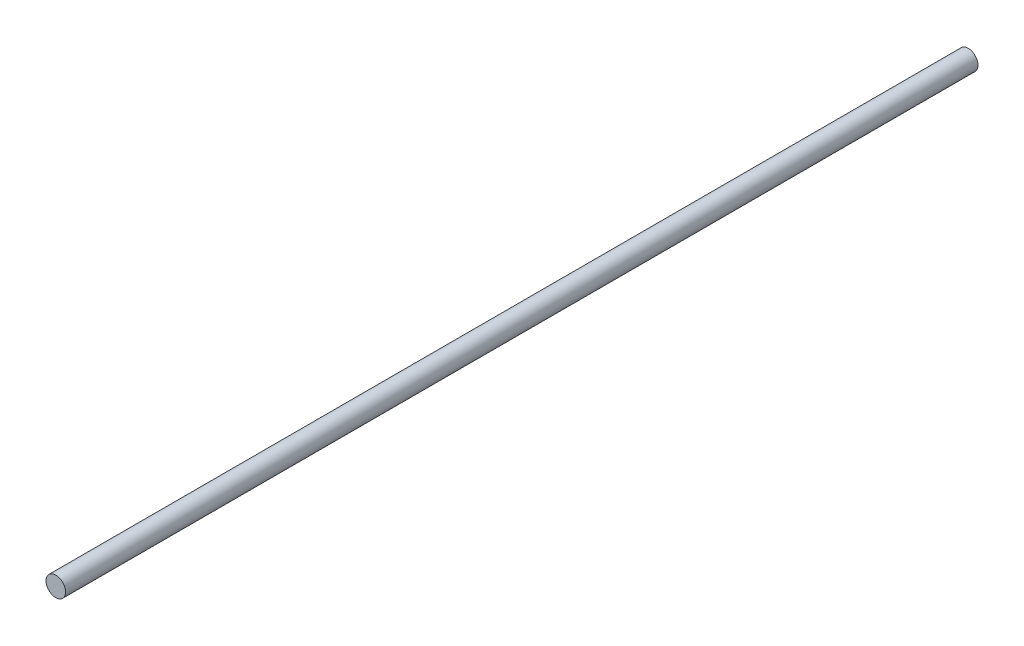
ISO-10303-21;
HEADER;
FILE_DESCRIPTION(('STEP AP214'),'2;1');
FILE_NAME('part.step','',(''),(''),'','','');
FILE_SCHEMA(('AUTOMOTIVE_DESIGN { 1 0 10303 214 1 1 1 1 }'));
ENDSEC;
DATA;
#1=APPLICATION_CONTEXT('core data for automotive mechanical design processes');
#2=APPLICATION_PROTOCOL_DEFINITION('international standard','automotive_design',2000,#1);
#3=PRODUCT_CONTEXT('',#1,'mechanical');
#4=PRODUCT('Part','Part','',(#3));
#5=PRODUCT_RELATED_PRODUCT_CATEGORY('part','',(#4));
#6=PRODUCT_DEFINITION_FORMATION('','',#4);
#7=PRODUCT_DEFINITION_CONTEXT('part definition',#1,'design');
#8=PRODUCT_DEFINITION('design','',#6,#7);
#9=PRODUCT_DEFINITION_SHAPE('','',#8);
#10=(LENGTH_UNIT() NAMED_UNIT(*) SI_UNIT(.MILLI.,.METRE.));
#11=(NAMED_UNIT(*) PLANE_ANGLE_UNIT() SI_UNIT($,.RADIAN.));
#12=(NAMED_UNIT(*) SI_UNIT($,.STERADIAN.) SOLID_ANGLE_UNIT());
#13=UNCERTAINTY_MEASURE_WITH_UNIT(LENGTH_MEASURE(1.E-05),#10,'distance_accuracy_value','');
#14=(GEOMETRIC_REPRESENTATION_CONTEXT(3) GLOBAL_UNCERTAINTY_ASSIGNED_CONTEXT((#13)) GLOBAL_UNIT_ASSIGNED_CONTEXT((#10,
#11,#12)) REPRESENTATION_CONTEXT('',''));
#15=CARTESIAN_POINT('',(0.,0.,0.));
#16=DIRECTION('',(0.,0.,1.));
#17=DIRECTION('',(1.,0.,0.));
#18=AXIS2_PLACEMENT_3D('',#15,#16,#17);
#19=CARTESIAN_POINT('',(0.,0.,700.));
#20=DIRECTION('',(0.,0.,-1.));
#21=DIRECTION('',(-1.,0.,0.));
#22=AXIS2_PLACEMENT_3D('',#19,#20,#21);
#23=CYLINDRICAL_SURFACE('',#22,7.5);
#24=CARTESIAN_POINT('',(0.,0.,700.));
#25=DIRECTION('',(0.,0.,1.));
#26=DIRECTION('',(1.,0.,0.));
#27=AXIS2_PLACEMENT_3D('',#24,#25,#26);
#28=CIRCLE('',#27,7.5);
#29=CARTESIAN_POINT('',(7.5,0.,700.));
#30=VERTEX_POINT('',#29);
#31=EDGE_CURVE('E10',#30,#30,#28,.T.);
#32=ORIENTED_EDGE('',*,*,#31,.F.);
#33=EDGE_LOOP('',(#32));
#34=FACE_BOUND('',#33,.T.);
#35=CARTESIAN_POINT('',(0.,0.,0.));
#36=DIRECTION('',(0.,0.,1.));
#37=DIRECTION('',(1.,0.,0.));
#38=AXIS2_PLACEMENT_3D('',#35,#36,#37);
#39=CIRCLE('',#38,7.5);
#40=CARTESIAN_POINT('',(7.5,0.,0.));
#41=VERTEX_POINT('',#40);
#42=EDGE_CURVE('E33',#41,#41,#39,.T.);
#43=ORIENTED_EDGE('',*,*,#42,.T.);
#44=EDGE_LOOP('',(#43));
#45=FACE_BOUND('',#44,.T.);
#46=ADVANCED_FACE('F30',(#34,#45),#23,.T.);
#47=CARTESIAN_POINT('',(0.,0.,700.));
#48=DIRECTION('',(0.,0.,1.));
#49=DIRECTION('',(1.,0.,0.));
#50=AXIS2_PLACEMENT_3D('',#47,#48,#49);
#51=PLANE('',#50);
#52=ORIENTED_EDGE('',*,*,#31,.T.);
#53=EDGE_LOOP('',(#52));
#54=FACE_BOUND('',#53,.T.);
#55=ADVANCED_FACE('F45',(#54),#51,.T.);
#56=CARTESIAN_POINT('',(0.,0.,0.));
#57=DIRECTION('',(0.,0.,1.));
#58=DIRECTION('',(1.,0.,0.));
#59=AXIS2_PLACEMENT_3D('',#56,#57,#58);
#60=PLANE('',#59);
#61=ORIENTED_EDGE('',*,*,#42,.F.);
#62=EDGE_LOOP('',(#61));
#63=FACE_BOUND('',#62,.T.);
#64=ADVANCED_FACE('F43',(#63),#60,.F.);
#65=CLOSED_SHELL('',(#46,#55,#64));
#66=MANIFOLD_SOLID_BREP('B2',#65);
#67=ADVANCED_BREP_SHAPE_REPRESENTATION('',(#18,#66),#14);
#68=SHAPE_DEFINITION_REPRESENTATION(#9,#67);
ENDSEC;
END-ISO-10303-21;
